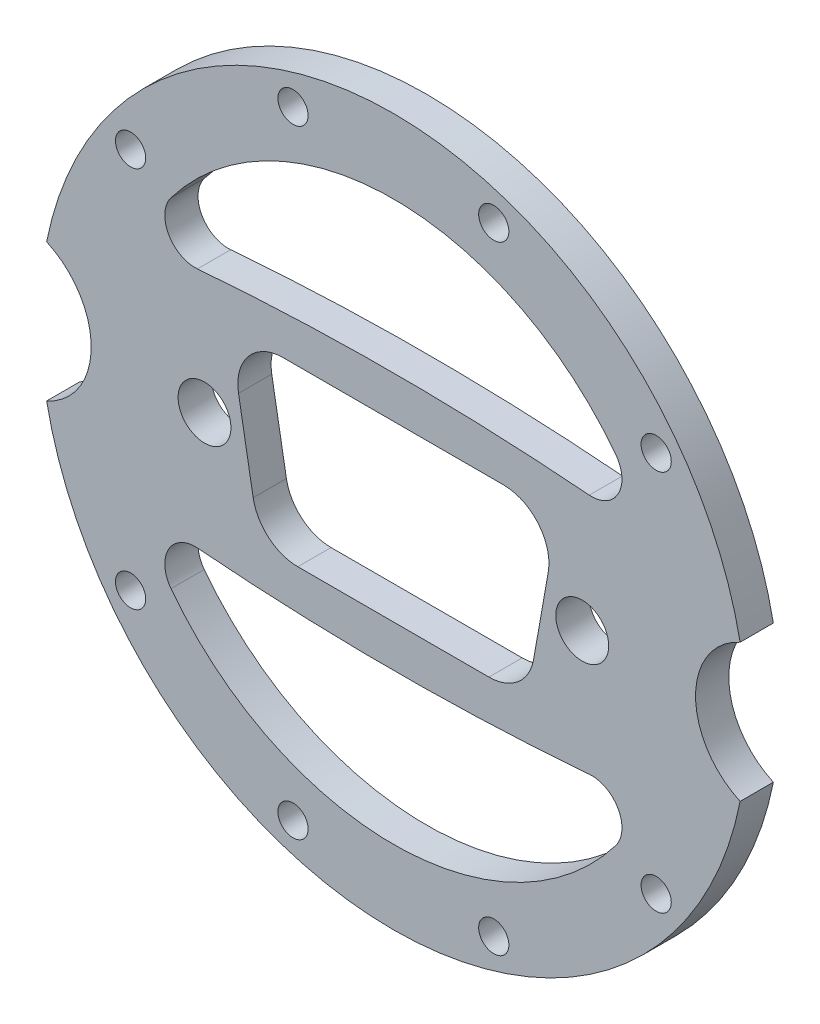
ISO-10303-21;
HEADER;
FILE_DESCRIPTION(('STEP AP214'),'2;1');
FILE_NAME('part.step','',(''),(''),'','','');
FILE_SCHEMA(('AUTOMOTIVE_DESIGN { 1 0 10303 214 1 1 1 1 }'));
ENDSEC;
DATA;
#1=APPLICATION_CONTEXT('core data for automotive mechanical design processes');
#2=APPLICATION_PROTOCOL_DEFINITION('international standard','automotive_design',2000,#1);
#3=PRODUCT_CONTEXT('',#1,'mechanical');
#4=PRODUCT('Part','Part','',(#3));
#5=PRODUCT_RELATED_PRODUCT_CATEGORY('part','',(#4));
#6=PRODUCT_DEFINITION_FORMATION('','',#4);
#7=PRODUCT_DEFINITION_CONTEXT('part definition',#1,'design');
#8=PRODUCT_DEFINITION('design','',#6,#7);
#9=PRODUCT_DEFINITION_SHAPE('','',#8);
#10=(LENGTH_UNIT() NAMED_UNIT(*) SI_UNIT(.MILLI.,.METRE.));
#11=(NAMED_UNIT(*) PLANE_ANGLE_UNIT() SI_UNIT($,.RADIAN.));
#12=(NAMED_UNIT(*) SI_UNIT($,.STERADIAN.) SOLID_ANGLE_UNIT());
#13=UNCERTAINTY_MEASURE_WITH_UNIT(LENGTH_MEASURE(1.E-05),#10,'distance_accuracy_value','');
#14=(GEOMETRIC_REPRESENTATION_CONTEXT(3) GLOBAL_UNCERTAINTY_ASSIGNED_CONTEXT((#13)) GLOBAL_UNIT_ASSIGNED_CONTEXT((#10,
#11,#12)) REPRESENTATION_CONTEXT('',''));
#15=CARTESIAN_POINT('',(0.,0.,0.));
#16=DIRECTION('',(0.,0.,1.));
#17=DIRECTION('',(1.,0.,0.));
#18=AXIS2_PLACEMENT_3D('',#15,#16,#17);
#19=CARTESIAN_POINT('',(0.,0.,2.2));
#20=DIRECTION('',(0.,0.,-1.));
#21=DIRECTION('',(-1.,0.,0.));
#22=AXIS2_PLACEMENT_3D('',#19,#20,#21);
#23=CYLINDRICAL_SURFACE('',#22,23.4);
#24=DIRECTION('',(0.,0.,-1.));
#25=VECTOR('',#24,1.);
#26=CARTESIAN_POINT('',(-22.9512,4.56096684486963,1.5));
#27=LINE('',#26,#25);
#28=CARTESIAN_POINT('',(-22.9512,4.56096684486963,2.2));
#29=VERTEX_POINT('',#28);
#30=CARTESIAN_POINT('',(-22.9512,4.56096684486963,0.));
#31=VERTEX_POINT('',#30);
#32=EDGE_CURVE('E11',#29,#31,#27,.T.);
#33=ORIENTED_EDGE('',*,*,#32,.F.);
#34=CARTESIAN_POINT('',(0.,0.,2.2));
#35=DIRECTION('',(0.,0.,1.));
#36=DIRECTION('',(1.,0.,0.));
#37=AXIS2_PLACEMENT_3D('',#34,#35,#36);
#38=CIRCLE('',#37,23.4);
#39=CARTESIAN_POINT('',(22.9512,4.56096684486963,2.2));
#40=VERTEX_POINT('',#39);
#41=EDGE_CURVE('E200',#40,#29,#38,.T.);
#42=ORIENTED_EDGE('',*,*,#41,.F.);
#43=DIRECTION('',(0.,0.,-1.));
#44=VECTOR('',#43,1.);
#45=CARTESIAN_POINT('',(22.9512,4.56096684486963,1.5));
#46=LINE('',#45,#44);
#47=CARTESIAN_POINT('',(22.9512,4.56096684486963,0.));
#48=VERTEX_POINT('',#47);
#49=EDGE_CURVE('E180',#48,#40,#46,.F.);
#50=ORIENTED_EDGE('',*,*,#49,.F.);
#51=CARTESIAN_POINT('',(0.,0.,0.));
#52=DIRECTION('',(0.,0.,1.));
#53=DIRECTION('',(1.,0.,0.));
#54=AXIS2_PLACEMENT_3D('',#51,#52,#53);
#55=CIRCLE('',#54,23.4);
#56=EDGE_CURVE('E189',#48,#31,#55,.T.);
#57=ORIENTED_EDGE('',*,*,#56,.T.);
#58=EDGE_LOOP('',(#33,#42,#50,#57));
#59=FACE_BOUND('',#58,.T.);
#60=ADVANCED_FACE('F39',(#59),#23,.T.);
#61=DIRECTION('',(0.,0.,-1.));
#62=VECTOR('',#61,1.);
#63=CARTESIAN_POINT('',(-22.9512,-4.56096684486963,1.5));
#64=LINE('',#63,#62);
#65=CARTESIAN_POINT('',(-22.9512,-4.56096684486963,0.));
#66=VERTEX_POINT('',#65);
#67=CARTESIAN_POINT('',(-22.9512,-4.56096684486963,2.2));
#68=VERTEX_POINT('',#67);
#69=EDGE_CURVE('E46',#66,#68,#64,.F.);
#70=ORIENTED_EDGE('',*,*,#69,.F.);
#71=CARTESIAN_POINT('',(22.9512,-4.56096684486963,0.));
#72=VERTEX_POINT('',#71);
#73=EDGE_CURVE('E187',#66,#72,#55,.T.);
#74=ORIENTED_EDGE('',*,*,#73,.T.);
#75=DIRECTION('',(0.,0.,-1.));
#76=VECTOR('',#75,1.);
#77=CARTESIAN_POINT('',(22.9512,-4.56096684486963,1.5));
#78=LINE('',#77,#76);
#79=CARTESIAN_POINT('',(22.9512,-4.56096684486963,2.2));
#80=VERTEX_POINT('',#79);
#81=EDGE_CURVE('E172',#80,#72,#78,.T.);
#82=ORIENTED_EDGE('',*,*,#81,.F.);
#83=EDGE_CURVE('E194',#68,#80,#38,.T.);
#84=ORIENTED_EDGE('',*,*,#83,.F.);
#85=EDGE_LOOP('',(#70,#74,#82,#84));
#86=FACE_BOUND('',#85,.T.);
#87=ADVANCED_FACE('F191',(#86),#23,.T.);
#88=CARTESIAN_POINT('',(0.,0.,2.2));
#89=DIRECTION('',(0.,0.,1.));
#90=DIRECTION('',(1.,0.,0.));
#91=AXIS2_PLACEMENT_3D('',#88,#89,#90);
#92=PLANE('',#91);
#93=CARTESIAN_POINT('',(7.29557674096337,2.75,2.2));
#94=DIRECTION('',(0.,0.,1.));
#95=DIRECTION('',(-1.,0.,0.));
#96=AXIS2_PLACEMENT_3D('',#93,#94,#95);
#97=CIRCLE('',#96,3.);
#98=CARTESIAN_POINT('',(10.25,2.2290554669992,2.2));
#99=VERTEX_POINT('',#98);
#100=CARTESIAN_POINT('',(7.29557674096337,5.75,2.2));
#101=VERTEX_POINT('',#100);
#102=EDGE_CURVE('E210',#99,#101,#97,.T.);
#103=ORIENTED_EDGE('',*,*,#102,.F.);
#104=DIRECTION('',(0.173648177666934,0.984807753012208,0.));
#105=VECTOR('',#104,1.);
#106=CARTESIAN_POINT('',(10.25,2.2290554669992,2.2));
#107=LINE('',#106,#105);
#108=CARTESIAN_POINT('',(9.28020160610342,-3.2709445330008,2.2));
#109=VERTEX_POINT('',#108);
#110=EDGE_CURVE('E220',#109,#99,#107,.T.);
#111=ORIENTED_EDGE('',*,*,#110,.F.);
#112=CARTESIAN_POINT('',(6.3257783470668,-2.75,2.2));
#113=DIRECTION('',(0.,0.,1.));
#114=DIRECTION('',(1.,0.,0.));
#115=AXIS2_PLACEMENT_3D('',#112,#113,#114);
#116=CIRCLE('',#115,3.);
#117=CARTESIAN_POINT('',(6.3257783470668,-5.75,2.2));
#118=VERTEX_POINT('',#117);
#119=EDGE_CURVE('E256',#118,#109,#116,.T.);
#120=ORIENTED_EDGE('',*,*,#119,.F.);
#121=DIRECTION('',(1.,0.,0.));
#122=VECTOR('',#121,1.);
#123=CARTESIAN_POINT('',(-6.3257783470668,-5.75,2.2));
#124=LINE('',#123,#122);
#125=CARTESIAN_POINT('',(-6.3257783470668,-5.75,2.2));
#126=VERTEX_POINT('',#125);
#127=EDGE_CURVE('E253',#126,#118,#124,.T.);
#128=ORIENTED_EDGE('',*,*,#127,.F.);
#129=CARTESIAN_POINT('',(-6.3257783470668,-2.75,2.2));
#130=DIRECTION('',(0.,0.,1.));
#131=DIRECTION('',(1.,0.,0.));
#132=AXIS2_PLACEMENT_3D('',#129,#130,#131);
#133=CIRCLE('',#132,3.);
#134=CARTESIAN_POINT('',(-9.28020160610343,-3.2709445330008,2.2));
#135=VERTEX_POINT('',#134);
#136=EDGE_CURVE('E250',#135,#126,#133,.T.);
#137=ORIENTED_EDGE('',*,*,#136,.F.);
#138=DIRECTION('',(0.173648177666934,-0.984807753012208,0.));
#139=VECTOR('',#138,1.);
#140=CARTESIAN_POINT('',(-10.25,2.2290554669992,2.2));
#141=LINE('',#140,#139);
#142=CARTESIAN_POINT('',(-10.25,2.2290554669992,2.2));
#143=VERTEX_POINT('',#142);
#144=EDGE_CURVE('E247',#143,#135,#141,.T.);
#145=ORIENTED_EDGE('',*,*,#144,.F.);
#146=CARTESIAN_POINT('',(-7.29557674096338,2.75,2.2));
#147=DIRECTION('',(0.,0.,1.));
#148=DIRECTION('',(1.,0.,0.));
#149=AXIS2_PLACEMENT_3D('',#146,#147,#148);
#150=CIRCLE('',#149,3.);
#151=CARTESIAN_POINT('',(-7.29557674096337,5.75,2.2));
#152=VERTEX_POINT('',#151);
#153=EDGE_CURVE('E244',#152,#143,#150,.T.);
#154=ORIENTED_EDGE('',*,*,#153,.F.);
#155=DIRECTION('',(-1.,0.,0.));
#156=VECTOR('',#155,1.);
#157=CARTESIAN_POINT('',(-7.29557674096337,5.75,2.2));
#158=LINE('',#157,#156);
#159=EDGE_CURVE('E212',#101,#152,#158,.T.);
#160=ORIENTED_EDGE('',*,*,#159,.F.);
#161=EDGE_LOOP('',(#103,#111,#120,#128,#137,#145,#154,#160));
#162=FACE_BOUND('',#161,.T.);
#163=CARTESIAN_POINT('',(-12.5,0.,2.2));
#164=DIRECTION('',(0.,0.,1.));
#165=DIRECTION('',(-1.,0.,0.));
#166=AXIS2_PLACEMENT_3D('',#163,#164,#165);
#167=CIRCLE('',#166,1.75);
#168=CARTESIAN_POINT('',(-14.25,0.,2.2));
#169=VERTEX_POINT('',#168);
#170=EDGE_CURVE('E263',#169,#169,#167,.T.);
#171=ORIENTED_EDGE('',*,*,#170,.F.);
#172=EDGE_LOOP('',(#171));
#173=FACE_BOUND('',#172,.T.);
#174=CARTESIAN_POINT('',(12.5,0.,2.2));
#175=DIRECTION('',(0.,0.,1.));
#176=DIRECTION('',(1.,0.,0.));
#177=AXIS2_PLACEMENT_3D('',#174,#175,#176);
#178=CIRCLE('',#177,1.75);
#179=CARTESIAN_POINT('',(14.25,0.,2.2));
#180=VERTEX_POINT('',#179);
#181=EDGE_CURVE('E281',#180,#180,#178,.T.);
#182=ORIENTED_EDGE('',*,*,#181,.F.);
#183=EDGE_LOOP('',(#182));
#184=FACE_BOUND('',#183,.T.);
#185=CARTESIAN_POINT('',(-17.3938653790616,-12.6373829242879,2.2));
#186=DIRECTION('',(0.,0.,1.));
#187=DIRECTION('',(1.,0.,0.));
#188=AXIS2_PLACEMENT_3D('',#185,#186,#187);
#189=CIRCLE('',#188,1.);
#190=CARTESIAN_POINT('',(-16.3938653790616,-12.6373829242879,2.2));
#191=VERTEX_POINT('',#190);
#192=EDGE_CURVE('E296',#191,#191,#189,.T.);
#193=ORIENTED_EDGE('',*,*,#192,.F.);
#194=EDGE_LOOP('',(#193));
#195=FACE_BOUND('',#194,.T.);
#196=CARTESIAN_POINT('',(6.6438653790611,-20.4477151003459,2.2));
#197=DIRECTION('',(0.,0.,1.));
#198=DIRECTION('',(1.,0.,0.));
#199=AXIS2_PLACEMENT_3D('',#196,#197,#198);
#200=CIRCLE('',#199,1.);
#201=CARTESIAN_POINT('',(7.6438653790611,-20.4477151003459,2.2));
#202=VERTEX_POINT('',#201);
#203=EDGE_CURVE('E308',#202,#202,#200,.T.);
#204=ORIENTED_EDGE('',*,*,#203,.F.);
#205=EDGE_LOOP('',(#204));
#206=FACE_BOUND('',#205,.T.);
#207=CARTESIAN_POINT('',(17.3938653790615,12.637382924288,2.2));
#208=DIRECTION('',(0.,0.,1.));
#209=DIRECTION('',(1.,0.,0.));
#210=AXIS2_PLACEMENT_3D('',#207,#208,#209);
#211=CIRCLE('',#210,1.);
#212=CARTESIAN_POINT('',(18.3938653790615,12.637382924288,2.2));
#213=VERTEX_POINT('',#212);
#214=EDGE_CURVE('E320',#213,#213,#211,.T.);
#215=ORIENTED_EDGE('',*,*,#214,.F.);
#216=EDGE_LOOP('',(#215));
#217=FACE_BOUND('',#216,.T.);
#218=CARTESIAN_POINT('',(6.64386537906153,20.4477151003458,2.2));
#219=DIRECTION('',(0.,0.,1.));
#220=DIRECTION('',(1.,0.,0.));
#221=AXIS2_PLACEMENT_3D('',#218,#219,#220);
#222=CIRCLE('',#221,0.999999999999999);
#223=CARTESIAN_POINT('',(7.64386537906152,20.4477151003458,2.2));
#224=VERTEX_POINT('',#223);
#225=EDGE_CURVE('E332',#224,#224,#222,.T.);
#226=ORIENTED_EDGE('',*,*,#225,.F.);
#227=EDGE_LOOP('',(#226));
#228=FACE_BOUND('',#227,.T.);
#229=ORIENTED_EDGE('',*,*,#41,.T.);
#230=CARTESIAN_POINT('',(-25.,0.,2.2));
#231=DIRECTION('',(0.,0.,1.));
#232=DIRECTION('',(1.,0.,0.));
#233=AXIS2_PLACEMENT_3D('',#230,#231,#232);
#234=CIRCLE('',#233,5.);
#235=EDGE_CURVE('E203',#29,#68,#234,.F.);
#236=ORIENTED_EDGE('',*,*,#235,.T.);
#237=ORIENTED_EDGE('',*,*,#83,.T.);
#238=CARTESIAN_POINT('',(25.,0.,2.2));
#239=DIRECTION('',(0.,0.,1.));
#240=DIRECTION('',(1.,0.,0.));
#241=AXIS2_PLACEMENT_3D('',#238,#239,#240);
#242=CIRCLE('',#241,5.);
#243=EDGE_CURVE('E175',#80,#40,#242,.F.);
#244=ORIENTED_EDGE('',*,*,#243,.T.);
#245=EDGE_LOOP('',(#229,#236,#237,#244));
#246=FACE_BOUND('',#245,.T.);
#247=CARTESIAN_POINT('',(13.12941512368,9.99342076118538,2.2));
#248=DIRECTION('',(0.,0.,1.));
#249=DIRECTION('',(1.,0.,0.));
#250=AXIS2_PLACEMENT_3D('',#247,#248,#249);
#251=CIRCLE('',#250,1.99999999999987);
#252=CARTESIAN_POINT('',(12.9673235789432,8.00000000000015,2.2));
#253=VERTEX_POINT('',#252);
#254=CARTESIAN_POINT('',(14.7208593810955,11.2047444898137,2.2));
#255=VERTEX_POINT('',#254);
#256=EDGE_CURVE('E371',#253,#255,#251,.T.);
#257=ORIENTED_EDGE('',*,*,#256,.F.);
#258=CARTESIAN_POINT('',(0.,-151.473660894829,2.2));
#259=DIRECTION('',(0.,0.,-1.));
#260=DIRECTION('',(-1.,0.,0.));
#261=AXIS2_PLACEMENT_3D('',#258,#259,#260);
#262=CIRCLE('',#261,160.);
#263=CARTESIAN_POINT('',(-12.9673235789432,8.00000000000015,2.2));
#264=VERTEX_POINT('',#263);
#265=EDGE_CURVE('E369',#264,#253,#262,.T.);
#266=ORIENTED_EDGE('',*,*,#265,.F.);
#267=CARTESIAN_POINT('',(-13.12941512368,9.99342076118538,2.2));
#268=DIRECTION('',(0.,0.,1.));
#269=DIRECTION('',(-1.,0.,0.));
#270=AXIS2_PLACEMENT_3D('',#267,#268,#269);
#271=CIRCLE('',#270,1.99999999999987);
#272=CARTESIAN_POINT('',(-14.7208593810956,11.2047444898138,2.2));
#273=VERTEX_POINT('',#272);
#274=EDGE_CURVE('E377',#273,#264,#271,.T.);
#275=ORIENTED_EDGE('',*,*,#274,.F.);
#276=CARTESIAN_POINT('',(0.,0.,2.2));
#277=DIRECTION('',(0.,0.,1.));
#278=DIRECTION('',(1.,0.,0.));
#279=AXIS2_PLACEMENT_3D('',#276,#277,#278);
#280=CIRCLE('',#279,18.5);
#281=EDGE_CURVE('E374',#255,#273,#280,.T.);
#282=ORIENTED_EDGE('',*,*,#281,.F.);
#283=EDGE_LOOP('',(#257,#266,#275,#282));
#284=FACE_BOUND('',#283,.T.);
#285=CARTESIAN_POINT('',(-13.12941512368,-9.99342076118538,2.2));
#286=DIRECTION('',(0.,0.,1.));
#287=DIRECTION('',(1.,0.,0.));
#288=AXIS2_PLACEMENT_3D('',#285,#286,#287);
#289=CIRCLE('',#288,1.99999999999987);
#290=CARTESIAN_POINT('',(-12.9673235789432,-8.00000000000015,2.2));
#291=VERTEX_POINT('',#290);
#292=CARTESIAN_POINT('',(-14.7208593810956,-11.2047444898138,2.2));
#293=VERTEX_POINT('',#292);
#294=EDGE_CURVE('E340',#291,#293,#289,.T.);
#295=ORIENTED_EDGE('',*,*,#294,.F.);
#296=CARTESIAN_POINT('',(0.,151.473660894829,2.2));
#297=DIRECTION('',(0.,0.,-1.));
#298=DIRECTION('',(1.,0.,0.));
#299=AXIS2_PLACEMENT_3D('',#296,#297,#298);
#300=CIRCLE('',#299,160.);
#301=CARTESIAN_POINT('',(12.9673235789432,-8.00000000000015,2.2));
#302=VERTEX_POINT('',#301);
#303=EDGE_CURVE('E338',#302,#291,#300,.T.);
#304=ORIENTED_EDGE('',*,*,#303,.F.);
#305=CARTESIAN_POINT('',(13.12941512368,-9.99342076118538,2.2));
#306=DIRECTION('',(0.,0.,1.));
#307=DIRECTION('',(-1.,0.,0.));
#308=AXIS2_PLACEMENT_3D('',#305,#306,#307);
#309=CIRCLE('',#308,1.99999999999987);
#310=CARTESIAN_POINT('',(14.7208593810956,-11.2047444898138,2.2));
#311=VERTEX_POINT('',#310);
#312=EDGE_CURVE('E346',#311,#302,#309,.T.);
#313=ORIENTED_EDGE('',*,*,#312,.F.);
#314=CARTESIAN_POINT('',(0.,0.,2.2));
#315=DIRECTION('',(0.,0.,1.));
#316=DIRECTION('',(1.,0.,0.));
#317=AXIS2_PLACEMENT_3D('',#314,#315,#316);
#318=CIRCLE('',#317,18.5);
#319=EDGE_CURVE('E343',#293,#311,#318,.T.);
#320=ORIENTED_EDGE('',*,*,#319,.F.);
#321=EDGE_LOOP('',(#295,#304,#313,#320));
#322=FACE_BOUND('',#321,.T.);
#323=CARTESIAN_POINT('',(-6.64386537906124,20.4477151003458,2.2));
#324=DIRECTION('',(0.,0.,1.));
#325=DIRECTION('',(1.,0.,0.));
#326=AXIS2_PLACEMENT_3D('',#323,#324,#325);
#327=CIRCLE('',#326,1.);
#328=CARTESIAN_POINT('',(-5.64386537906124,20.4477151003458,2.2));
#329=VERTEX_POINT('',#328);
#330=EDGE_CURVE('E326',#329,#329,#327,.T.);
#331=ORIENTED_EDGE('',*,*,#330,.F.);
#332=EDGE_LOOP('',(#331));
#333=FACE_BOUND('',#332,.T.);
#334=CARTESIAN_POINT('',(17.3938653790612,-12.6373829242884,2.2));
#335=DIRECTION('',(0.,0.,1.));
#336=DIRECTION('',(1.,0.,0.));
#337=AXIS2_PLACEMENT_3D('',#334,#335,#336);
#338=CIRCLE('',#337,1.);
#339=CARTESIAN_POINT('',(18.3938653790612,-12.6373829242884,2.2));
#340=VERTEX_POINT('',#339);
#341=EDGE_CURVE('E314',#340,#340,#338,.T.);
#342=ORIENTED_EDGE('',*,*,#341,.F.);
#343=EDGE_LOOP('',(#342));
#344=FACE_BOUND('',#343,.T.);
#345=CARTESIAN_POINT('',(-6.64386537906167,-20.4477151003457,2.2));
#346=DIRECTION('',(0.,0.,1.));
#347=DIRECTION('',(1.,0.,0.));
#348=AXIS2_PLACEMENT_3D('',#345,#346,#347);
#349=CIRCLE('',#348,1.);
#350=CARTESIAN_POINT('',(-5.64386537906167,-20.4477151003457,2.2));
#351=VERTEX_POINT('',#350);
#352=EDGE_CURVE('E302',#351,#351,#349,.T.);
#353=ORIENTED_EDGE('',*,*,#352,.F.);
#354=EDGE_LOOP('',(#353));
#355=FACE_BOUND('',#354,.T.);
#356=CARTESIAN_POINT('',(-17.3938653790611,12.6373829242885,2.2));
#357=DIRECTION('',(0.,0.,1.));
#358=DIRECTION('',(1.,0.,0.));
#359=AXIS2_PLACEMENT_3D('',#356,#357,#358);
#360=CIRCLE('',#359,1.00000000000001);
#361=CARTESIAN_POINT('',(-16.3938653790611,12.6373829242885,2.2));
#362=VERTEX_POINT('',#361);
#363=EDGE_CURVE('E290',#362,#362,#360,.T.);
#364=ORIENTED_EDGE('',*,*,#363,.F.);
#365=EDGE_LOOP('',(#364));
#366=FACE_BOUND('',#365,.T.);
#367=ADVANCED_FACE('F207',(#162,#173,#184,#195,#206,#217,#228,#246,#284,#322,#333,#344,#355,
#366),#92,.T.);
#368=CARTESIAN_POINT('',(0.,0.,0.));
#369=DIRECTION('',(0.,0.,1.));
#370=DIRECTION('',(1.,0.,0.));
#371=AXIS2_PLACEMENT_3D('',#368,#369,#370);
#372=PLANE('',#371);
#373=CARTESIAN_POINT('',(-25.,0.,0.));
#374=DIRECTION('',(0.,0.,1.));
#375=DIRECTION('',(1.,0.,0.));
#376=AXIS2_PLACEMENT_3D('',#373,#374,#375);
#377=CIRCLE('',#376,5.);
#378=EDGE_CURVE('E52',#66,#31,#377,.T.);
#379=ORIENTED_EDGE('',*,*,#378,.T.);
#380=ORIENTED_EDGE('',*,*,#56,.F.);
#381=CARTESIAN_POINT('',(25.,0.,0.));
#382=DIRECTION('',(0.,0.,1.));
#383=DIRECTION('',(1.,0.,0.));
#384=AXIS2_PLACEMENT_3D('',#381,#382,#383);
#385=CIRCLE('',#384,5.);
#386=EDGE_CURVE('E60',#48,#72,#385,.T.);
#387=ORIENTED_EDGE('',*,*,#386,.T.);
#388=ORIENTED_EDGE('',*,*,#73,.F.);
#389=EDGE_LOOP('',(#379,#380,#387,#388));
#390=FACE_BOUND('',#389,.T.);
#391=DIRECTION('',(0.173648177666934,0.984807753012208,0.));
#392=VECTOR('',#391,1.);
#393=CARTESIAN_POINT('',(10.25,2.2290554669992,0.));
#394=LINE('',#393,#392);
#395=CARTESIAN_POINT('',(9.28020160610342,-3.2709445330008,0.));
#396=VERTEX_POINT('',#395);
#397=CARTESIAN_POINT('',(10.25,2.2290554669992,0.));
#398=VERTEX_POINT('',#397);
#399=EDGE_CURVE('E238',#396,#398,#394,.T.);
#400=ORIENTED_EDGE('',*,*,#399,.T.);
#401=CARTESIAN_POINT('',(7.29557674096337,2.75,0.));
#402=DIRECTION('',(0.,0.,1.));
#403=DIRECTION('',(-1.,0.,0.));
#404=AXIS2_PLACEMENT_3D('',#401,#402,#403);
#405=CIRCLE('',#404,3.);
#406=CARTESIAN_POINT('',(7.29557674096337,5.75,0.));
#407=VERTEX_POINT('',#406);
#408=EDGE_CURVE('E216',#398,#407,#405,.T.);
#409=ORIENTED_EDGE('',*,*,#408,.T.);
#410=DIRECTION('',(-1.,0.,0.));
#411=VECTOR('',#410,1.);
#412=CARTESIAN_POINT('',(-7.29557674096337,5.75,0.));
#413=LINE('',#412,#411);
#414=CARTESIAN_POINT('',(-7.29557674096337,5.75,0.));
#415=VERTEX_POINT('',#414);
#416=EDGE_CURVE('E219',#407,#415,#413,.T.);
#417=ORIENTED_EDGE('',*,*,#416,.T.);
#418=CARTESIAN_POINT('',(-7.29557674096338,2.75,0.));
#419=DIRECTION('',(0.,0.,1.));
#420=DIRECTION('',(1.,0.,0.));
#421=AXIS2_PLACEMENT_3D('',#418,#419,#420);
#422=CIRCLE('',#421,3.);
#423=CARTESIAN_POINT('',(-10.25,2.2290554669992,0.));
#424=VERTEX_POINT('',#423);
#425=EDGE_CURVE('E223',#415,#424,#422,.T.);
#426=ORIENTED_EDGE('',*,*,#425,.T.);
#427=DIRECTION('',(0.173648177666934,-0.984807753012208,0.));
#428=VECTOR('',#427,1.);
#429=CARTESIAN_POINT('',(-10.25,2.2290554669992,0.));
#430=LINE('',#429,#428);
#431=CARTESIAN_POINT('',(-9.28020160610343,-3.2709445330008,0.));
#432=VERTEX_POINT('',#431);
#433=EDGE_CURVE('E226',#424,#432,#430,.T.);
#434=ORIENTED_EDGE('',*,*,#433,.T.);
#435=CARTESIAN_POINT('',(-6.3257783470668,-2.75,0.));
#436=DIRECTION('',(0.,0.,1.));
#437=DIRECTION('',(1.,0.,0.));
#438=AXIS2_PLACEMENT_3D('',#435,#436,#437);
#439=CIRCLE('',#438,3.);
#440=CARTESIAN_POINT('',(-6.3257783470668,-5.75,0.));
#441=VERTEX_POINT('',#440);
#442=EDGE_CURVE('E229',#432,#441,#439,.T.);
#443=ORIENTED_EDGE('',*,*,#442,.T.);
#444=DIRECTION('',(1.,0.,0.));
#445=VECTOR('',#444,1.);
#446=CARTESIAN_POINT('',(-6.3257783470668,-5.75,0.));
#447=LINE('',#446,#445);
#448=CARTESIAN_POINT('',(6.3257783470668,-5.75,0.));
#449=VERTEX_POINT('',#448);
#450=EDGE_CURVE('E232',#441,#449,#447,.T.);
#451=ORIENTED_EDGE('',*,*,#450,.T.);
#452=CARTESIAN_POINT('',(6.3257783470668,-2.75,0.));
#453=DIRECTION('',(0.,0.,1.));
#454=DIRECTION('',(1.,0.,0.));
#455=AXIS2_PLACEMENT_3D('',#452,#453,#454);
#456=CIRCLE('',#455,3.);
#457=EDGE_CURVE('E235',#449,#396,#456,.T.);
#458=ORIENTED_EDGE('',*,*,#457,.T.);
#459=EDGE_LOOP('',(#400,#409,#417,#426,#434,#443,#451,#458));
#460=FACE_BOUND('',#459,.T.);
#461=CARTESIAN_POINT('',(-12.5,0.,0.));
#462=DIRECTION('',(0.,0.,1.));
#463=DIRECTION('',(-1.,0.,0.));
#464=AXIS2_PLACEMENT_3D('',#461,#462,#463);
#465=CIRCLE('',#464,1.75);
#466=CARTESIAN_POINT('',(-14.25,0.,0.));
#467=VERTEX_POINT('',#466);
#468=EDGE_CURVE('E278',#467,#467,#465,.T.);
#469=ORIENTED_EDGE('',*,*,#468,.T.);
#470=EDGE_LOOP('',(#469));
#471=FACE_BOUND('',#470,.T.);
#472=CARTESIAN_POINT('',(12.5,0.,0.));
#473=DIRECTION('',(0.,0.,1.));
#474=DIRECTION('',(1.,0.,0.));
#475=AXIS2_PLACEMENT_3D('',#472,#473,#474);
#476=CIRCLE('',#475,1.75);
#477=CARTESIAN_POINT('',(14.25,0.,0.));
#478=VERTEX_POINT('',#477);
#479=EDGE_CURVE('E284',#478,#478,#476,.T.);
#480=ORIENTED_EDGE('',*,*,#479,.T.);
#481=EDGE_LOOP('',(#480));
#482=FACE_BOUND('',#481,.T.);
#483=CARTESIAN_POINT('',(0.,-151.473660894829,0.));
#484=DIRECTION('',(0.,0.,-1.));
#485=DIRECTION('',(-1.,0.,0.));
#486=AXIS2_PLACEMENT_3D('',#483,#484,#485);
#487=CIRCLE('',#486,160.);
#488=CARTESIAN_POINT('',(-12.9673235789432,8.00000000000015,0.));
#489=VERTEX_POINT('',#488);
#490=CARTESIAN_POINT('',(12.9673235789432,8.00000000000015,0.));
#491=VERTEX_POINT('',#490);
#492=EDGE_CURVE('E368',#489,#491,#487,.T.);
#493=ORIENTED_EDGE('',*,*,#492,.T.);
#494=CARTESIAN_POINT('',(13.12941512368,9.99342076118538,0.));
#495=DIRECTION('',(0.,0.,1.));
#496=DIRECTION('',(1.,0.,0.));
#497=AXIS2_PLACEMENT_3D('',#494,#495,#496);
#498=CIRCLE('',#497,1.99999999999987);
#499=CARTESIAN_POINT('',(14.7208593810955,11.2047444898137,0.));
#500=VERTEX_POINT('',#499);
#501=EDGE_CURVE('E382',#491,#500,#498,.T.);
#502=ORIENTED_EDGE('',*,*,#501,.T.);
#503=CARTESIAN_POINT('',(0.,0.,0.));
#504=DIRECTION('',(0.,0.,1.));
#505=DIRECTION('',(1.,0.,0.));
#506=AXIS2_PLACEMENT_3D('',#503,#504,#505);
#507=CIRCLE('',#506,18.5);
#508=CARTESIAN_POINT('',(-14.7208593810956,11.2047444898138,0.));
#509=VERTEX_POINT('',#508);
#510=EDGE_CURVE('E385',#500,#509,#507,.T.);
#511=ORIENTED_EDGE('',*,*,#510,.T.);
#512=CARTESIAN_POINT('',(-13.12941512368,9.99342076118538,0.));
#513=DIRECTION('',(0.,0.,1.));
#514=DIRECTION('',(-1.,0.,0.));
#515=AXIS2_PLACEMENT_3D('',#512,#513,#514);
#516=CIRCLE('',#515,1.99999999999987);
#517=EDGE_CURVE('E372',#509,#489,#516,.T.);
#518=ORIENTED_EDGE('',*,*,#517,.T.);
#519=EDGE_LOOP('',(#493,#502,#511,#518));
#520=FACE_BOUND('',#519,.T.);
#521=CARTESIAN_POINT('',(0.,151.473660894829,0.));
#522=DIRECTION('',(0.,0.,-1.));
#523=DIRECTION('',(1.,0.,0.));
#524=AXIS2_PLACEMENT_3D('',#521,#522,#523);
#525=CIRCLE('',#524,160.);
#526=CARTESIAN_POINT('',(12.9673235789432,-8.00000000000015,0.));
#527=VERTEX_POINT('',#526);
#528=CARTESIAN_POINT('',(-12.9673235789432,-8.00000000000015,0.));
#529=VERTEX_POINT('',#528);
#530=EDGE_CURVE('E335',#527,#529,#525,.T.);
#531=ORIENTED_EDGE('',*,*,#530,.T.);
#532=CARTESIAN_POINT('',(-13.12941512368,-9.99342076118538,0.));
#533=DIRECTION('',(0.,0.,1.));
#534=DIRECTION('',(1.,0.,0.));
#535=AXIS2_PLACEMENT_3D('',#532,#533,#534);
#536=CIRCLE('',#535,1.99999999999987);
#537=CARTESIAN_POINT('',(-14.7208593810956,-11.2047444898138,0.));
#538=VERTEX_POINT('',#537);
#539=EDGE_CURVE('E351',#529,#538,#536,.T.);
#540=ORIENTED_EDGE('',*,*,#539,.T.);
#541=CARTESIAN_POINT('',(0.,0.,0.));
#542=DIRECTION('',(0.,0.,1.));
#543=DIRECTION('',(1.,0.,0.));
#544=AXIS2_PLACEMENT_3D('',#541,#542,#543);
#545=CIRCLE('',#544,18.5);
#546=CARTESIAN_POINT('',(14.7208593810955,-11.2047444898137,0.));
#547=VERTEX_POINT('',#546);
#548=EDGE_CURVE('E354',#538,#547,#545,.T.);
#549=ORIENTED_EDGE('',*,*,#548,.T.);
#550=CARTESIAN_POINT('',(13.12941512368,-9.99342076118538,0.));
#551=DIRECTION('',(0.,0.,1.));
#552=DIRECTION('',(-1.,0.,0.));
#553=AXIS2_PLACEMENT_3D('',#550,#551,#552);
#554=CIRCLE('',#553,1.99999999999987);
#555=EDGE_CURVE('E341',#547,#527,#554,.T.);
#556=ORIENTED_EDGE('',*,*,#555,.T.);
#557=EDGE_LOOP('',(#531,#540,#549,#556));
#558=FACE_BOUND('',#557,.T.);
#559=CARTESIAN_POINT('',(6.64386537906153,20.4477151003458,0.));
#560=DIRECTION('',(0.,0.,1.));
#561=DIRECTION('',(1.,0.,0.));
#562=AXIS2_PLACEMENT_3D('',#559,#560,#561);
#563=CIRCLE('',#562,0.999999999999999);
#564=CARTESIAN_POINT('',(7.64386537906152,20.4477151003458,0.));
#565=VERTEX_POINT('',#564);
#566=EDGE_CURVE('E329',#565,#565,#563,.T.);
#567=ORIENTED_EDGE('',*,*,#566,.T.);
#568=EDGE_LOOP('',(#567));
#569=FACE_BOUND('',#568,.T.);
#570=CARTESIAN_POINT('',(-6.64386537906124,20.4477151003458,0.));
#571=DIRECTION('',(0.,0.,1.));
#572=DIRECTION('',(1.,0.,0.));
#573=AXIS2_PLACEMENT_3D('',#570,#571,#572);
#574=CIRCLE('',#573,1.);
#575=CARTESIAN_POINT('',(-5.64386537906124,20.4477151003458,0.));
#576=VERTEX_POINT('',#575);
#577=EDGE_CURVE('E323',#576,#576,#574,.T.);
#578=ORIENTED_EDGE('',*,*,#577,.T.);
#579=EDGE_LOOP('',(#578));
#580=FACE_BOUND('',#579,.T.);
#581=CARTESIAN_POINT('',(17.3938653790615,12.637382924288,0.));
#582=DIRECTION('',(0.,0.,1.));
#583=DIRECTION('',(1.,0.,0.));
#584=AXIS2_PLACEMENT_3D('',#581,#582,#583);
#585=CIRCLE('',#584,1.);
#586=CARTESIAN_POINT('',(18.3938653790615,12.637382924288,0.));
#587=VERTEX_POINT('',#586);
#588=EDGE_CURVE('E317',#587,#587,#585,.T.);
#589=ORIENTED_EDGE('',*,*,#588,.T.);
#590=EDGE_LOOP('',(#589));
#591=FACE_BOUND('',#590,.T.);
#592=CARTESIAN_POINT('',(17.3938653790612,-12.6373829242884,0.));
#593=DIRECTION('',(0.,0.,1.));
#594=DIRECTION('',(1.,0.,0.));
#595=AXIS2_PLACEMENT_3D('',#592,#593,#594);
#596=CIRCLE('',#595,1.);
#597=CARTESIAN_POINT('',(18.3938653790612,-12.6373829242884,0.));
#598=VERTEX_POINT('',#597);
#599=EDGE_CURVE('E311',#598,#598,#596,.T.);
#600=ORIENTED_EDGE('',*,*,#599,.T.);
#601=EDGE_LOOP('',(#600));
#602=FACE_BOUND('',#601,.T.);
#603=CARTESIAN_POINT('',(6.6438653790611,-20.4477151003459,0.));
#604=DIRECTION('',(0.,0.,1.));
#605=DIRECTION('',(1.,0.,0.));
#606=AXIS2_PLACEMENT_3D('',#603,#604,#605);
#607=CIRCLE('',#606,1.);
#608=CARTESIAN_POINT('',(7.6438653790611,-20.4477151003459,0.));
#609=VERTEX_POINT('',#608);
#610=EDGE_CURVE('E305',#609,#609,#607,.T.);
#611=ORIENTED_EDGE('',*,*,#610,.T.);
#612=EDGE_LOOP('',(#611));
#613=FACE_BOUND('',#612,.T.);
#614=CARTESIAN_POINT('',(-6.64386537906167,-20.4477151003457,0.));
#615=DIRECTION('',(0.,0.,1.));
#616=DIRECTION('',(1.,0.,0.));
#617=AXIS2_PLACEMENT_3D('',#614,#615,#616);
#618=CIRCLE('',#617,1.);
#619=CARTESIAN_POINT('',(-5.64386537906167,-20.4477151003457,0.));
#620=VERTEX_POINT('',#619);
#621=EDGE_CURVE('E299',#620,#620,#618,.T.);
#622=ORIENTED_EDGE('',*,*,#621,.T.);
#623=EDGE_LOOP('',(#622));
#624=FACE_BOUND('',#623,.T.);
#625=CARTESIAN_POINT('',(-17.3938653790616,-12.6373829242879,0.));
#626=DIRECTION('',(0.,0.,1.));
#627=DIRECTION('',(1.,0.,0.));
#628=AXIS2_PLACEMENT_3D('',#625,#626,#627);
#629=CIRCLE('',#628,1.);
#630=CARTESIAN_POINT('',(-16.3938653790616,-12.6373829242879,0.));
#631=VERTEX_POINT('',#630);
#632=EDGE_CURVE('E293',#631,#631,#629,.T.);
#633=ORIENTED_EDGE('',*,*,#632,.T.);
#634=EDGE_LOOP('',(#633));
#635=FACE_BOUND('',#634,.T.);
#636=CARTESIAN_POINT('',(-17.3938653790611,12.6373829242885,0.));
#637=DIRECTION('',(0.,0.,1.));
#638=DIRECTION('',(1.,0.,0.));
#639=AXIS2_PLACEMENT_3D('',#636,#637,#638);
#640=CIRCLE('',#639,1.00000000000001);
#641=CARTESIAN_POINT('',(-16.3938653790611,12.6373829242885,0.));
#642=VERTEX_POINT('',#641);
#643=EDGE_CURVE('E287',#642,#642,#640,.T.);
#644=ORIENTED_EDGE('',*,*,#643,.T.);
#645=EDGE_LOOP('',(#644));
#646=FACE_BOUND('',#645,.T.);
#647=ADVANCED_FACE('F185',(#390,#460,#471,#482,#520,#558,#569,#580,#591,#602,#613,#624,#635,
#646),#372,.F.);
#648=CARTESIAN_POINT('',(0.,-151.473660894829,2.2));
#649=DIRECTION('',(0.,0.,-1.));
#650=DIRECTION('',(-1.,0.,0.));
#651=AXIS2_PLACEMENT_3D('',#648,#649,#650);
#652=CYLINDRICAL_SURFACE('',#651,160.);
#653=ORIENTED_EDGE('',*,*,#492,.F.);
#654=DIRECTION('',(0.,0.,-1.));
#655=VECTOR('',#654,1.);
#656=CARTESIAN_POINT('',(-12.9673235789432,8.00000000000015,2.2));
#657=LINE('',#656,#655);
#658=EDGE_CURVE('E379',#264,#489,#657,.T.);
#659=ORIENTED_EDGE('',*,*,#658,.F.);
#660=ORIENTED_EDGE('',*,*,#265,.T.);
#661=DIRECTION('',(0.,0.,-1.));
#662=VECTOR('',#661,1.);
#663=CARTESIAN_POINT('',(12.9673235789432,8.00000000000015,2.2));
#664=LINE('',#663,#662);
#665=EDGE_CURVE('E192',#253,#491,#664,.T.);
#666=ORIENTED_EDGE('',*,*,#665,.T.);
#667=EDGE_LOOP('',(#653,#659,#660,#666));
#668=FACE_BOUND('',#667,.T.);
#669=ADVANCED_FACE('F408',(#668),#652,.T.);
#670=CARTESIAN_POINT('',(13.12941512368,9.99342076118538,2.2));
#671=DIRECTION('',(0.,0.,-1.));
#672=DIRECTION('',(-1.,0.,0.));
#673=AXIS2_PLACEMENT_3D('',#670,#671,#672);
#674=CYLINDRICAL_SURFACE('',#673,1.99999999999987);
#675=ORIENTED_EDGE('',*,*,#501,.F.);
#676=ORIENTED_EDGE('',*,*,#665,.F.);
#677=ORIENTED_EDGE('',*,*,#256,.T.);
#678=DIRECTION('',(0.,0.,-1.));
#679=VECTOR('',#678,1.);
#680=CARTESIAN_POINT('',(14.7208593810955,11.2047444898137,2.2));
#681=LINE('',#680,#679);
#682=EDGE_CURVE('E196',#255,#500,#681,.T.);
#683=ORIENTED_EDGE('',*,*,#682,.T.);
#684=EDGE_LOOP('',(#675,#676,#677,#683));
#685=FACE_BOUND('',#684,.T.);
#686=ADVANCED_FACE('F397',(#685),#674,.F.);
#687=CARTESIAN_POINT('',(0.,0.,2.2));
#688=DIRECTION('',(0.,0.,-1.));
#689=DIRECTION('',(-1.,0.,0.));
#690=AXIS2_PLACEMENT_3D('',#687,#688,#689);
#691=CYLINDRICAL_SURFACE('',#690,18.5);
#692=ORIENTED_EDGE('',*,*,#510,.F.);
#693=ORIENTED_EDGE('',*,*,#682,.F.);
#694=ORIENTED_EDGE('',*,*,#281,.T.);
#695=DIRECTION('',(0.,0.,-1.));
#696=VECTOR('',#695,1.);
#697=CARTESIAN_POINT('',(-14.7208593810956,11.2047444898138,2.2));
#698=LINE('',#697,#696);
#699=EDGE_CURVE('E392',#273,#509,#698,.T.);
#700=ORIENTED_EDGE('',*,*,#699,.T.);
#701=EDGE_LOOP('',(#692,#693,#694,#700));
#702=FACE_BOUND('',#701,.T.);
#703=ADVANCED_FACE('F402',(#702),#691,.F.);
#704=CARTESIAN_POINT('',(-13.12941512368,9.99342076118538,2.2));
#705=DIRECTION('',(0.,0.,-1.));
#706=DIRECTION('',(-1.,0.,0.));
#707=AXIS2_PLACEMENT_3D('',#704,#705,#706);
#708=CYLINDRICAL_SURFACE('',#707,1.99999999999987);
#709=ORIENTED_EDGE('',*,*,#517,.F.);
#710=ORIENTED_EDGE('',*,*,#699,.F.);
#711=ORIENTED_EDGE('',*,*,#274,.T.);
#712=ORIENTED_EDGE('',*,*,#658,.T.);
#713=EDGE_LOOP('',(#709,#710,#711,#712));
#714=FACE_BOUND('',#713,.T.);
#715=ADVANCED_FACE('F411',(#714),#708,.F.);
#716=CARTESIAN_POINT('',(0.,151.473660894829,2.2));
#717=DIRECTION('',(0.,0.,-1.));
#718=DIRECTION('',(-1.,0.,0.));
#719=AXIS2_PLACEMENT_3D('',#716,#717,#718);
#720=CYLINDRICAL_SURFACE('',#719,160.);
#721=ORIENTED_EDGE('',*,*,#530,.F.);
#722=DIRECTION('',(0.,0.,-1.));
#723=VECTOR('',#722,1.);
#724=CARTESIAN_POINT('',(12.9673235789432,-8.00000000000015,2.2));
#725=LINE('',#724,#723);
#726=EDGE_CURVE('E348',#302,#527,#725,.T.);
#727=ORIENTED_EDGE('',*,*,#726,.F.);
#728=ORIENTED_EDGE('',*,*,#303,.T.);
#729=DIRECTION('',(0.,0.,-1.));
#730=VECTOR('',#729,1.);
#731=CARTESIAN_POINT('',(-12.9673235789432,-8.00000000000015,2.2));
#732=LINE('',#731,#730);
#733=EDGE_CURVE('E365',#291,#529,#732,.T.);
#734=ORIENTED_EDGE('',*,*,#733,.T.);
#735=EDGE_LOOP('',(#721,#727,#728,#734));
#736=FACE_BOUND('',#735,.T.);
#737=ADVANCED_FACE('F482',(#736),#720,.T.);
#738=CARTESIAN_POINT('',(-13.12941512368,-9.99342076118538,2.2));
#739=DIRECTION('',(0.,0.,-1.));
#740=DIRECTION('',(-1.,0.,0.));
#741=AXIS2_PLACEMENT_3D('',#738,#739,#740);
#742=CYLINDRICAL_SURFACE('',#741,1.99999999999987);
#743=ORIENTED_EDGE('',*,*,#539,.F.);
#744=ORIENTED_EDGE('',*,*,#733,.F.);
#745=ORIENTED_EDGE('',*,*,#294,.T.);
#746=DIRECTION('',(0.,0.,-1.));
#747=VECTOR('',#746,1.);
#748=CARTESIAN_POINT('',(-14.7208593810956,-11.2047444898138,2.2));
#749=LINE('',#748,#747);
#750=EDGE_CURVE('E363',#293,#538,#749,.T.);
#751=ORIENTED_EDGE('',*,*,#750,.T.);
#752=EDGE_LOOP('',(#743,#744,#745,#751));
#753=FACE_BOUND('',#752,.T.);
#754=ADVANCED_FACE('F489',(#753),#742,.F.);
#755=CARTESIAN_POINT('',(0.,0.,2.2));
#756=DIRECTION('',(0.,0.,-1.));
#757=DIRECTION('',(-1.,0.,0.));
#758=AXIS2_PLACEMENT_3D('',#755,#756,#757);
#759=CYLINDRICAL_SURFACE('',#758,18.5);
#760=ORIENTED_EDGE('',*,*,#548,.F.);
#761=ORIENTED_EDGE('',*,*,#750,.F.);
#762=ORIENTED_EDGE('',*,*,#319,.T.);
#763=DIRECTION('',(0.,0.,-1.));
#764=VECTOR('',#763,1.);
#765=CARTESIAN_POINT('',(14.7208593810955,-11.2047444898137,2.2));
#766=LINE('',#765,#764);
#767=EDGE_CURVE('E361',#311,#547,#766,.T.);
#768=ORIENTED_EDGE('',*,*,#767,.T.);
#769=EDGE_LOOP('',(#760,#761,#762,#768));
#770=FACE_BOUND('',#769,.T.);
#771=ADVANCED_FACE('F497',(#770),#759,.F.);
#772=CARTESIAN_POINT('',(13.12941512368,-9.99342076118538,2.2));
#773=DIRECTION('',(0.,0.,-1.));
#774=DIRECTION('',(-1.,0.,0.));
#775=AXIS2_PLACEMENT_3D('',#772,#773,#774);
#776=CYLINDRICAL_SURFACE('',#775,1.99999999999987);
#777=ORIENTED_EDGE('',*,*,#555,.F.);
#778=ORIENTED_EDGE('',*,*,#767,.F.);
#779=ORIENTED_EDGE('',*,*,#312,.T.);
#780=ORIENTED_EDGE('',*,*,#726,.T.);
#781=EDGE_LOOP('',(#777,#778,#779,#780));
#782=FACE_BOUND('',#781,.T.);
#783=ADVANCED_FACE('F505',(#782),#776,.F.);
#784=CARTESIAN_POINT('',(6.64386537906153,20.4477151003458,2.2));
#785=DIRECTION('',(0.,0.,-1.));
#786=DIRECTION('',(-1.,0.,0.));
#787=AXIS2_PLACEMENT_3D('',#784,#785,#786);
#788=CYLINDRICAL_SURFACE('',#787,0.999999999999999);
#789=ORIENTED_EDGE('',*,*,#225,.T.);
#790=EDGE_LOOP('',(#789));
#791=FACE_BOUND('',#790,.T.);
#792=ORIENTED_EDGE('',*,*,#566,.F.);
#793=EDGE_LOOP('',(#792));
#794=FACE_BOUND('',#793,.T.);
#795=ADVANCED_FACE('F513',(#791,#794),#788,.F.);
#796=CARTESIAN_POINT('',(-6.64386537906124,20.4477151003458,2.2));
#797=DIRECTION('',(0.,0.,-1.));
#798=DIRECTION('',(-1.,0.,0.));
#799=AXIS2_PLACEMENT_3D('',#796,#797,#798);
#800=CYLINDRICAL_SURFACE('',#799,1.);
#801=ORIENTED_EDGE('',*,*,#330,.T.);
#802=EDGE_LOOP('',(#801));
#803=FACE_BOUND('',#802,.T.);
#804=ORIENTED_EDGE('',*,*,#577,.F.);
#805=EDGE_LOOP('',(#804));
#806=FACE_BOUND('',#805,.T.);
#807=ADVANCED_FACE('F521',(#803,#806),#800,.F.);
#808=CARTESIAN_POINT('',(17.3938653790615,12.637382924288,2.2));
#809=DIRECTION('',(0.,0.,-1.));
#810=DIRECTION('',(-1.,0.,0.));
#811=AXIS2_PLACEMENT_3D('',#808,#809,#810);
#812=CYLINDRICAL_SURFACE('',#811,1.);
#813=ORIENTED_EDGE('',*,*,#214,.T.);
#814=EDGE_LOOP('',(#813));
#815=FACE_BOUND('',#814,.T.);
#816=ORIENTED_EDGE('',*,*,#588,.F.);
#817=EDGE_LOOP('',(#816));
#818=FACE_BOUND('',#817,.T.);
#819=ADVANCED_FACE('F529',(#815,#818),#812,.F.);
#820=CARTESIAN_POINT('',(17.3938653790612,-12.6373829242884,2.2));
#821=DIRECTION('',(0.,0.,-1.));
#822=DIRECTION('',(-1.,0.,0.));
#823=AXIS2_PLACEMENT_3D('',#820,#821,#822);
#824=CYLINDRICAL_SURFACE('',#823,1.);
#825=ORIENTED_EDGE('',*,*,#341,.T.);
#826=EDGE_LOOP('',(#825));
#827=FACE_BOUND('',#826,.T.);
#828=ORIENTED_EDGE('',*,*,#599,.F.);
#829=EDGE_LOOP('',(#828));
#830=FACE_BOUND('',#829,.T.);
#831=ADVANCED_FACE('F537',(#827,#830),#824,.F.);
#832=CARTESIAN_POINT('',(6.6438653790611,-20.4477151003459,2.2));
#833=DIRECTION('',(0.,0.,-1.));
#834=DIRECTION('',(-1.,0.,0.));
#835=AXIS2_PLACEMENT_3D('',#832,#833,#834);
#836=CYLINDRICAL_SURFACE('',#835,1.);
#837=ORIENTED_EDGE('',*,*,#203,.T.);
#838=EDGE_LOOP('',(#837));
#839=FACE_BOUND('',#838,.T.);
#840=ORIENTED_EDGE('',*,*,#610,.F.);
#841=EDGE_LOOP('',(#840));
#842=FACE_BOUND('',#841,.T.);
#843=ADVANCED_FACE('F545',(#839,#842),#836,.F.);
#844=CARTESIAN_POINT('',(-6.64386537906167,-20.4477151003457,2.2));
#845=DIRECTION('',(0.,0.,-1.));
#846=DIRECTION('',(-1.,0.,0.));
#847=AXIS2_PLACEMENT_3D('',#844,#845,#846);
#848=CYLINDRICAL_SURFACE('',#847,1.);
#849=ORIENTED_EDGE('',*,*,#352,.T.);
#850=EDGE_LOOP('',(#849));
#851=FACE_BOUND('',#850,.T.);
#852=ORIENTED_EDGE('',*,*,#621,.F.);
#853=EDGE_LOOP('',(#852));
#854=FACE_BOUND('',#853,.T.);
#855=ADVANCED_FACE('F553',(#851,#854),#848,.F.);
#856=CARTESIAN_POINT('',(-17.3938653790616,-12.6373829242879,2.2));
#857=DIRECTION('',(0.,0.,-1.));
#858=DIRECTION('',(-1.,0.,0.));
#859=AXIS2_PLACEMENT_3D('',#856,#857,#858);
#860=CYLINDRICAL_SURFACE('',#859,1.);
#861=ORIENTED_EDGE('',*,*,#192,.T.);
#862=EDGE_LOOP('',(#861));
#863=FACE_BOUND('',#862,.T.);
#864=ORIENTED_EDGE('',*,*,#632,.F.);
#865=EDGE_LOOP('',(#864));
#866=FACE_BOUND('',#865,.T.);
#867=ADVANCED_FACE('F433',(#863,#866),#860,.F.);
#868=CARTESIAN_POINT('',(-17.3938653790611,12.6373829242885,2.2));
#869=DIRECTION('',(0.,0.,-1.));
#870=DIRECTION('',(-1.,0.,0.));
#871=AXIS2_PLACEMENT_3D('',#868,#869,#870);
#872=CYLINDRICAL_SURFACE('',#871,1.00000000000001);
#873=ORIENTED_EDGE('',*,*,#363,.T.);
#874=EDGE_LOOP('',(#873));
#875=FACE_BOUND('',#874,.T.);
#876=ORIENTED_EDGE('',*,*,#643,.F.);
#877=EDGE_LOOP('',(#876));
#878=FACE_BOUND('',#877,.T.);
#879=ADVANCED_FACE('F429',(#875,#878),#872,.F.);
#880=CARTESIAN_POINT('',(12.5,0.,0.));
#881=DIRECTION('',(0.,0.,1.));
#882=DIRECTION('',(1.,0.,0.));
#883=AXIS2_PLACEMENT_3D('',#880,#881,#882);
#884=CYLINDRICAL_SURFACE('',#883,1.75);
#885=ORIENTED_EDGE('',*,*,#479,.F.);
#886=EDGE_LOOP('',(#885));
#887=FACE_BOUND('',#886,.T.);
#888=ORIENTED_EDGE('',*,*,#181,.T.);
#889=EDGE_LOOP('',(#888));
#890=FACE_BOUND('',#889,.T.);
#891=ADVANCED_FACE('F432',(#887,#890),#884,.F.);
#892=CARTESIAN_POINT('',(-12.5,0.,0.));
#893=DIRECTION('',(0.,0.,1.));
#894=DIRECTION('',(1.,0.,0.));
#895=AXIS2_PLACEMENT_3D('',#892,#893,#894);
#896=CYLINDRICAL_SURFACE('',#895,1.75);
#897=ORIENTED_EDGE('',*,*,#468,.F.);
#898=EDGE_LOOP('',(#897));
#899=FACE_BOUND('',#898,.T.);
#900=ORIENTED_EDGE('',*,*,#170,.T.);
#901=EDGE_LOOP('',(#900));
#902=FACE_BOUND('',#901,.T.);
#903=ADVANCED_FACE('F579',(#899,#902),#896,.F.);
#904=CARTESIAN_POINT('',(7.29557674096337,2.75,0.));
#905=DIRECTION('',(0.,0.,1.));
#906=DIRECTION('',(1.,0.,0.));
#907=AXIS2_PLACEMENT_3D('',#904,#905,#906);
#908=CYLINDRICAL_SURFACE('',#907,3.);
#909=ORIENTED_EDGE('',*,*,#102,.T.);
#910=DIRECTION('',(0.,0.,1.));
#911=VECTOR('',#910,1.);
#912=CARTESIAN_POINT('',(7.29557674096337,5.75,0.));
#913=LINE('',#912,#911);
#914=EDGE_CURVE('E240',#407,#101,#913,.T.);
#915=ORIENTED_EDGE('',*,*,#914,.F.);
#916=ORIENTED_EDGE('',*,*,#408,.F.);
#917=DIRECTION('',(0.,0.,1.));
#918=VECTOR('',#917,1.);
#919=CARTESIAN_POINT('',(10.25,2.2290554669992,0.));
#920=LINE('',#919,#918);
#921=EDGE_CURVE('E261',#398,#99,#920,.T.);
#922=ORIENTED_EDGE('',*,*,#921,.T.);
#923=EDGE_LOOP('',(#909,#915,#916,#922));
#924=FACE_BOUND('',#923,.T.);
#925=ADVANCED_FACE('F587',(#924),#908,.F.);
#926=CARTESIAN_POINT('',(10.25,2.2290554669992,0.));
#927=DIRECTION('',(0.984807753012207,-0.173648177666934,0.));
#928=DIRECTION('',(0.173648177666934,0.984807753012208,0.));
#929=AXIS2_PLACEMENT_3D('',#926,#927,#928);
#930=PLANE('',#929);
#931=ORIENTED_EDGE('',*,*,#110,.T.);
#932=ORIENTED_EDGE('',*,*,#921,.F.);
#933=ORIENTED_EDGE('',*,*,#399,.F.);
#934=DIRECTION('',(0.,0.,1.));
#935=VECTOR('',#934,1.);
#936=CARTESIAN_POINT('',(9.28020160610342,-3.2709445330008,0.));
#937=LINE('',#936,#935);
#938=EDGE_CURVE('E264',#396,#109,#937,.T.);
#939=ORIENTED_EDGE('',*,*,#938,.T.);
#940=EDGE_LOOP('',(#931,#932,#933,#939));
#941=FACE_BOUND('',#940,.T.);
#942=ADVANCED_FACE('F595',(#941),#930,.F.);
#943=CARTESIAN_POINT('',(6.3257783470668,-2.75,0.));
#944=DIRECTION('',(0.,0.,1.));
#945=DIRECTION('',(1.,0.,0.));
#946=AXIS2_PLACEMENT_3D('',#943,#944,#945);
#947=CYLINDRICAL_SURFACE('',#946,3.);
#948=ORIENTED_EDGE('',*,*,#119,.T.);
#949=ORIENTED_EDGE('',*,*,#938,.F.);
#950=ORIENTED_EDGE('',*,*,#457,.F.);
#951=DIRECTION('',(0.,0.,1.));
#952=VECTOR('',#951,1.);
#953=CARTESIAN_POINT('',(6.3257783470668,-5.75,0.));
#954=LINE('',#953,#952);
#955=EDGE_CURVE('E266',#449,#118,#954,.T.);
#956=ORIENTED_EDGE('',*,*,#955,.T.);
#957=EDGE_LOOP('',(#948,#949,#950,#956));
#958=FACE_BOUND('',#957,.T.);
#959=ADVANCED_FACE('F603',(#958),#947,.F.);
#960=CARTESIAN_POINT('',(-6.3257783470668,-5.75,0.));
#961=DIRECTION('',(0.,-1.,0.));
#962=DIRECTION('',(0.,0.,-1.));
#963=AXIS2_PLACEMENT_3D('',#960,#961,#962);
#964=PLANE('',#963);
#965=ORIENTED_EDGE('',*,*,#127,.T.);
#966=ORIENTED_EDGE('',*,*,#955,.F.);
#967=ORIENTED_EDGE('',*,*,#450,.F.);
#968=DIRECTION('',(0.,0.,1.));
#969=VECTOR('',#968,1.);
#970=CARTESIAN_POINT('',(-6.3257783470668,-5.75,0.));
#971=LINE('',#970,#969);
#972=EDGE_CURVE('E268',#441,#126,#971,.T.);
#973=ORIENTED_EDGE('',*,*,#972,.T.);
#974=EDGE_LOOP('',(#965,#966,#967,#973));
#975=FACE_BOUND('',#974,.T.);
#976=ADVANCED_FACE('F611',(#975),#964,.F.);
#977=CARTESIAN_POINT('',(-6.3257783470668,-2.75,0.));
#978=DIRECTION('',(0.,0.,1.));
#979=DIRECTION('',(1.,0.,0.));
#980=AXIS2_PLACEMENT_3D('',#977,#978,#979);
#981=CYLINDRICAL_SURFACE('',#980,3.);
#982=ORIENTED_EDGE('',*,*,#136,.T.);
#983=ORIENTED_EDGE('',*,*,#972,.F.);
#984=ORIENTED_EDGE('',*,*,#442,.F.);
#985=DIRECTION('',(0.,0.,1.));
#986=VECTOR('',#985,1.);
#987=CARTESIAN_POINT('',(-9.28020160610343,-3.2709445330008,0.));
#988=LINE('',#987,#986);
#989=EDGE_CURVE('E270',#432,#135,#988,.T.);
#990=ORIENTED_EDGE('',*,*,#989,.T.);
#991=EDGE_LOOP('',(#982,#983,#984,#990));
#992=FACE_BOUND('',#991,.T.);
#993=ADVANCED_FACE('F619',(#992),#981,.F.);
#994=CARTESIAN_POINT('',(-10.25,2.2290554669992,0.));
#995=DIRECTION('',(-0.984807753012207,-0.173648177666934,0.));
#996=DIRECTION('',(0.173648177666934,-0.984807753012208,0.));
#997=AXIS2_PLACEMENT_3D('',#994,#995,#996);
#998=PLANE('',#997);
#999=ORIENTED_EDGE('',*,*,#144,.T.);
#1000=ORIENTED_EDGE('',*,*,#989,.F.);
#1001=ORIENTED_EDGE('',*,*,#433,.F.);
#1002=DIRECTION('',(0.,0.,1.));
#1003=VECTOR('',#1002,1.);
#1004=CARTESIAN_POINT('',(-10.25,2.2290554669992,0.));
#1005=LINE('',#1004,#1003);
#1006=EDGE_CURVE('E272',#424,#143,#1005,.T.);
#1007=ORIENTED_EDGE('',*,*,#1006,.T.);
#1008=EDGE_LOOP('',(#999,#1000,#1001,#1007));
#1009=FACE_BOUND('',#1008,.T.);
#1010=ADVANCED_FACE('F627',(#1009),#998,.F.);
#1011=CARTESIAN_POINT('',(-7.29557674096338,2.75,0.));
#1012=DIRECTION('',(0.,0.,1.));
#1013=DIRECTION('',(1.,0.,0.));
#1014=AXIS2_PLACEMENT_3D('',#1011,#1012,#1013);
#1015=CYLINDRICAL_SURFACE('',#1014,3.);
#1016=ORIENTED_EDGE('',*,*,#153,.T.);
#1017=ORIENTED_EDGE('',*,*,#1006,.F.);
#1018=ORIENTED_EDGE('',*,*,#425,.F.);
#1019=DIRECTION('',(0.,0.,1.));
#1020=VECTOR('',#1019,1.);
#1021=CARTESIAN_POINT('',(-7.29557674096337,5.75,0.));
#1022=LINE('',#1021,#1020);
#1023=EDGE_CURVE('E274',#415,#152,#1022,.T.);
#1024=ORIENTED_EDGE('',*,*,#1023,.T.);
#1025=EDGE_LOOP('',(#1016,#1017,#1018,#1024));
#1026=FACE_BOUND('',#1025,.T.);
#1027=ADVANCED_FACE('F635',(#1026),#1015,.F.);
#1028=CARTESIAN_POINT('',(-7.29557674096337,5.75,0.));
#1029=DIRECTION('',(0.,1.,0.));
#1030=DIRECTION('',(0.,0.,1.));
#1031=AXIS2_PLACEMENT_3D('',#1028,#1029,#1030);
#1032=PLANE('',#1031);
#1033=ORIENTED_EDGE('',*,*,#159,.T.);
#1034=ORIENTED_EDGE('',*,*,#1023,.F.);
#1035=ORIENTED_EDGE('',*,*,#416,.F.);
#1036=ORIENTED_EDGE('',*,*,#914,.T.);
#1037=EDGE_LOOP('',(#1033,#1034,#1035,#1036));
#1038=FACE_BOUND('',#1037,.T.);
#1039=ADVANCED_FACE('F642',(#1038),#1032,.F.);
#1040=CARTESIAN_POINT('',(25.,0.,3.));
#1041=DIRECTION('',(0.,0.,-1.));
#1042=DIRECTION('',(-1.,0.,0.));
#1043=AXIS2_PLACEMENT_3D('',#1040,#1041,#1042);
#1044=CYLINDRICAL_SURFACE('',#1043,5.);
#1045=ORIENTED_EDGE('',*,*,#81,.T.);
#1046=ORIENTED_EDGE('',*,*,#386,.F.);
#1047=ORIENTED_EDGE('',*,*,#49,.T.);
#1048=ORIENTED_EDGE('',*,*,#243,.F.);
#1049=EDGE_LOOP('',(#1045,#1046,#1047,#1048));
#1050=FACE_BOUND('',#1049,.T.);
#1051=ADVANCED_FACE('F173',(#1050),#1044,.F.);
#1052=CARTESIAN_POINT('',(-25.,0.,3.));
#1053=DIRECTION('',(0.,0.,-1.));
#1054=DIRECTION('',(-1.,0.,0.));
#1055=AXIS2_PLACEMENT_3D('',#1052,#1053,#1054);
#1056=CYLINDRICAL_SURFACE('',#1055,5.);
#1057=ORIENTED_EDGE('',*,*,#32,.T.);
#1058=ORIENTED_EDGE('',*,*,#378,.F.);
#1059=ORIENTED_EDGE('',*,*,#69,.T.);
#1060=ORIENTED_EDGE('',*,*,#235,.F.);
#1061=EDGE_LOOP('',(#1057,#1058,#1059,#1060));
#1062=FACE_BOUND('',#1061,.T.);
#1063=ADVANCED_FACE('F202',(#1062),#1056,.F.);
#1064=CLOSED_SHELL('',(#60,#87,#367,#647,#669,#686,#703,#715,#737,#754,#771,#783,#795,#807,#819,
#831,#843,#855,#867,#879,#891,#903,#925,#942,#959,#976,#993,#1010,#1027,#1039,#1051,#1063));
#1065=MANIFOLD_SOLID_BREP('B2',#1064);
#1066=ADVANCED_BREP_SHAPE_REPRESENTATION('',(#18,#1065),#14);
#1067=SHAPE_DEFINITION_REPRESENTATION(#9,#1066);
ENDSEC;
END-ISO-10303-21;
